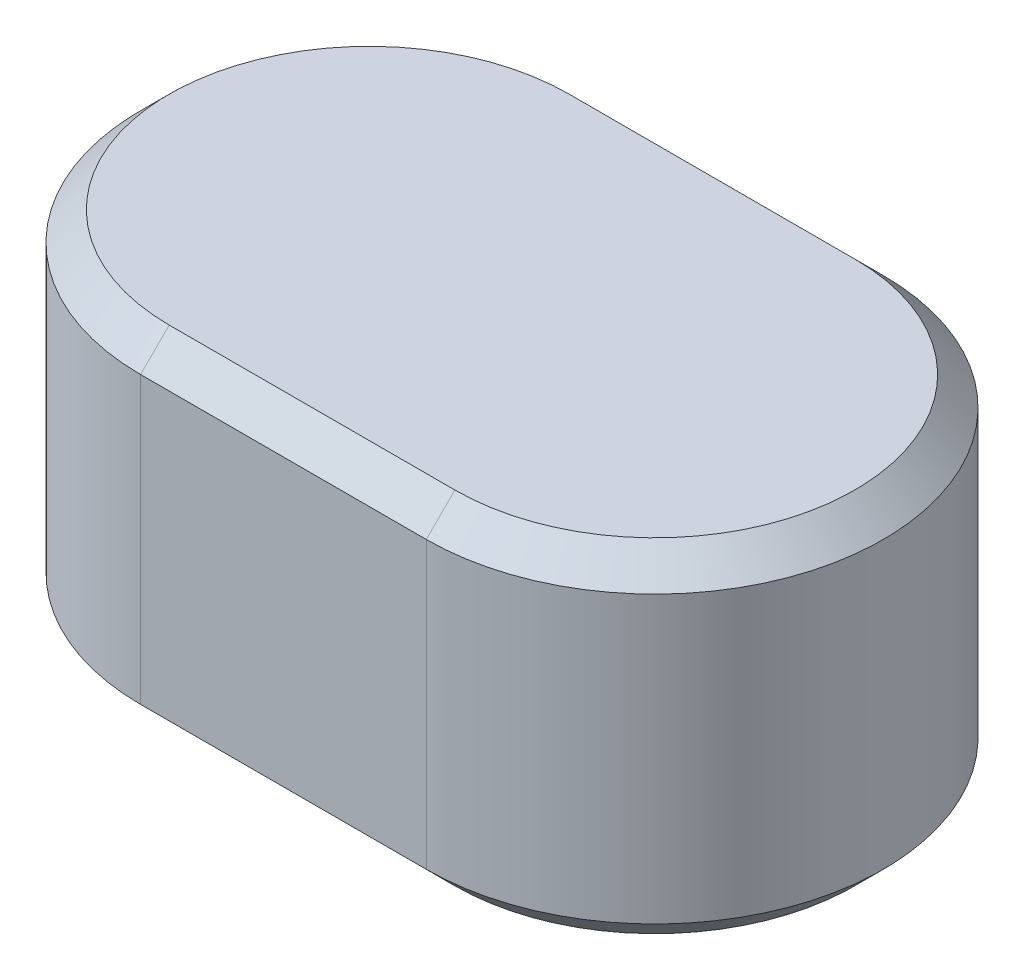
ISO-10303-21;
HEADER;
FILE_DESCRIPTION(('STEP AP214'),'2;1');
FILE_NAME('part.step','',(''),(''),'','','');
FILE_SCHEMA(('AUTOMOTIVE_DESIGN { 1 0 10303 214 1 1 1 1 }'));
ENDSEC;
DATA;
#1=APPLICATION_CONTEXT('core data for automotive mechanical design processes');
#2=APPLICATION_PROTOCOL_DEFINITION('international standard','automotive_design',2000,#1);
#3=PRODUCT_CONTEXT('',#1,'mechanical');
#4=PRODUCT('Part','Part','',(#3));
#5=PRODUCT_RELATED_PRODUCT_CATEGORY('part','',(#4));
#6=PRODUCT_DEFINITION_FORMATION('','',#4);
#7=PRODUCT_DEFINITION_CONTEXT('part definition',#1,'design');
#8=PRODUCT_DEFINITION('design','',#6,#7);
#9=PRODUCT_DEFINITION_SHAPE('','',#8);
#10=(LENGTH_UNIT() NAMED_UNIT(*) SI_UNIT(.MILLI.,.METRE.));
#11=(NAMED_UNIT(*) PLANE_ANGLE_UNIT() SI_UNIT($,.RADIAN.));
#12=(NAMED_UNIT(*) SI_UNIT($,.STERADIAN.) SOLID_ANGLE_UNIT());
#13=UNCERTAINTY_MEASURE_WITH_UNIT(LENGTH_MEASURE(1.E-05),#10,'distance_accuracy_value','');
#14=(GEOMETRIC_REPRESENTATION_CONTEXT(3) GLOBAL_UNCERTAINTY_ASSIGNED_CONTEXT((#13)) GLOBAL_UNIT_ASSIGNED_CONTEXT((#10,
#11,#12)) REPRESENTATION_CONTEXT('',''));
#15=CARTESIAN_POINT('',(0.,0.,0.));
#16=DIRECTION('',(0.,0.,1.));
#17=DIRECTION('',(1.,0.,0.));
#18=AXIS2_PLACEMENT_3D('',#15,#16,#17);
#19=CARTESIAN_POINT('',(-2.5,6.,0.));
#20=DIRECTION('',(0.,-1.,0.));
#21=DIRECTION('',(0.,0.,-1.));
#22=AXIS2_PLACEMENT_3D('',#19,#20,#21);
#23=CYLINDRICAL_SURFACE('',#22,4.);
#24=DIRECTION('',(0.,-1.,0.));
#25=VECTOR('',#24,1.);
#26=CARTESIAN_POINT('',(-2.5,6.,-4.));
#27=LINE('',#26,#25);
#28=CARTESIAN_POINT('',(-2.5,5.5,-4.));
#29=VERTEX_POINT('',#28);
#30=CARTESIAN_POINT('',(-2.5,0.500000000000002,-4.));
#31=VERTEX_POINT('',#30);
#32=EDGE_CURVE('E161',#29,#31,#27,.T.);
#33=ORIENTED_EDGE('',*,*,#32,.T.);
#34=CARTESIAN_POINT('',(-2.5,0.500000000000002,0.));
#35=DIRECTION('',(0.,1.,0.));
#36=DIRECTION('',(0.,0.,1.));
#37=AXIS2_PLACEMENT_3D('',#34,#35,#36);
#38=CIRCLE('',#37,4.);
#39=CARTESIAN_POINT('',(-2.5,0.500000000000002,4.));
#40=VERTEX_POINT('',#39);
#41=EDGE_CURVE('E175',#31,#40,#38,.T.);
#42=ORIENTED_EDGE('',*,*,#41,.T.);
#43=DIRECTION('',(0.,-1.,0.));
#44=VECTOR('',#43,1.);
#45=CARTESIAN_POINT('',(-2.5,6.,4.));
#46=LINE('',#45,#44);
#47=CARTESIAN_POINT('',(-2.5,5.5,4.));
#48=VERTEX_POINT('',#47);
#49=EDGE_CURVE('E132',#48,#40,#46,.T.);
#50=ORIENTED_EDGE('',*,*,#49,.F.);
#51=CARTESIAN_POINT('',(-2.5,5.5,0.));
#52=DIRECTION('',(0.,1.,0.));
#53=DIRECTION('',(0.,0.,1.));
#54=AXIS2_PLACEMENT_3D('',#51,#52,#53);
#55=CIRCLE('',#54,4.);
#56=EDGE_CURVE('E178',#48,#29,#55,.F.);
#57=ORIENTED_EDGE('',*,*,#56,.T.);
#58=EDGE_LOOP('',(#33,#42,#50,#57));
#59=FACE_BOUND('',#58,.T.);
#60=ADVANCED_FACE('F41',(#59),#23,.T.);
#61=CARTESIAN_POINT('',(-2.5,6.,4.));
#62=DIRECTION('',(0.,0.,-1.));
#63=DIRECTION('',(-1.,0.,0.));
#64=AXIS2_PLACEMENT_3D('',#61,#62,#63);
#65=PLANE('',#64);
#66=ORIENTED_EDGE('',*,*,#49,.T.);
#67=DIRECTION('',(1.,0.,0.));
#68=VECTOR('',#67,1.);
#69=CARTESIAN_POINT('',(-2.5,0.500000000000002,4.));
#70=LINE('',#69,#68);
#71=CARTESIAN_POINT('',(2.5,0.500000000000002,4.));
#72=VERTEX_POINT('',#71);
#73=EDGE_CURVE('E130',#40,#72,#70,.T.);
#74=ORIENTED_EDGE('',*,*,#73,.T.);
#75=DIRECTION('',(0.,-1.,0.));
#76=VECTOR('',#75,1.);
#77=CARTESIAN_POINT('',(2.5,6.,4.));
#78=LINE('',#77,#76);
#79=CARTESIAN_POINT('',(2.5,5.5,4.));
#80=VERTEX_POINT('',#79);
#81=EDGE_CURVE('E112',#80,#72,#78,.T.);
#82=ORIENTED_EDGE('',*,*,#81,.F.);
#83=DIRECTION('',(-1.,0.,0.));
#84=VECTOR('',#83,1.);
#85=CARTESIAN_POINT('',(-2.5,5.5,4.));
#86=LINE('',#85,#84);
#87=EDGE_CURVE('E127',#80,#48,#86,.T.);
#88=ORIENTED_EDGE('',*,*,#87,.T.);
#89=EDGE_LOOP('',(#66,#74,#82,#88));
#90=FACE_BOUND('',#89,.T.);
#91=ADVANCED_FACE('F126',(#90),#65,.F.);
#92=CARTESIAN_POINT('',(2.5,6.,0.));
#93=DIRECTION('',(0.,-1.,0.));
#94=DIRECTION('',(0.,0.,-1.));
#95=AXIS2_PLACEMENT_3D('',#92,#93,#94);
#96=CYLINDRICAL_SURFACE('',#95,4.);
#97=ORIENTED_EDGE('',*,*,#81,.T.);
#98=CARTESIAN_POINT('',(2.5,0.500000000000002,0.));
#99=DIRECTION('',(0.,1.,0.));
#100=DIRECTION('',(0.,0.,1.));
#101=AXIS2_PLACEMENT_3D('',#98,#99,#100);
#102=CIRCLE('',#101,4.);
#103=CARTESIAN_POINT('',(2.5,0.500000000000002,-4.));
#104=VERTEX_POINT('',#103);
#105=EDGE_CURVE('E119',#72,#104,#102,.T.);
#106=ORIENTED_EDGE('',*,*,#105,.T.);
#107=DIRECTION('',(0.,-1.,0.));
#108=VECTOR('',#107,1.);
#109=CARTESIAN_POINT('',(2.5,6.,-4.));
#110=LINE('',#109,#108);
#111=CARTESIAN_POINT('',(2.5,5.5,-4.));
#112=VERTEX_POINT('',#111);
#113=EDGE_CURVE('E114',#112,#104,#110,.T.);
#114=ORIENTED_EDGE('',*,*,#113,.F.);
#115=CARTESIAN_POINT('',(2.5,5.5,0.));
#116=DIRECTION('',(0.,1.,0.));
#117=DIRECTION('',(0.,0.,1.));
#118=AXIS2_PLACEMENT_3D('',#115,#116,#117);
#119=CIRCLE('',#118,4.);
#120=EDGE_CURVE('E109',#112,#80,#119,.F.);
#121=ORIENTED_EDGE('',*,*,#120,.T.);
#122=EDGE_LOOP('',(#97,#106,#114,#121));
#123=FACE_BOUND('',#122,.T.);
#124=ADVANCED_FACE('F111',(#123),#96,.T.);
#125=CARTESIAN_POINT('',(-2.5,6.,-4.));
#126=DIRECTION('',(0.,0.,1.));
#127=DIRECTION('',(1.,0.,0.));
#128=AXIS2_PLACEMENT_3D('',#125,#126,#127);
#129=PLANE('',#128);
#130=ORIENTED_EDGE('',*,*,#113,.T.);
#131=DIRECTION('',(-1.,0.,0.));
#132=VECTOR('',#131,1.);
#133=CARTESIAN_POINT('',(-2.5,0.500000000000002,-4.));
#134=LINE('',#133,#132);
#135=EDGE_CURVE('E181',#104,#31,#134,.T.);
#136=ORIENTED_EDGE('',*,*,#135,.T.);
#137=ORIENTED_EDGE('',*,*,#32,.F.);
#138=DIRECTION('',(1.,0.,0.));
#139=VECTOR('',#138,1.);
#140=CARTESIAN_POINT('',(2.5,5.5,-4.));
#141=LINE('',#140,#139);
#142=EDGE_CURVE('E184',#29,#112,#141,.T.);
#143=ORIENTED_EDGE('',*,*,#142,.T.);
#144=EDGE_LOOP('',(#130,#136,#137,#143));
#145=FACE_BOUND('',#144,.T.);
#146=ADVANCED_FACE('F232',(#145),#129,.F.);
#147=CARTESIAN_POINT('',(-2.5,6.,0.));
#148=DIRECTION('',(0.,1.,0.));
#149=DIRECTION('',(0.,0.,1.));
#150=AXIS2_PLACEMENT_3D('',#147,#148,#149);
#151=PLANE('',#150);
#152=CARTESIAN_POINT('',(2.5,6.,0.));
#153=DIRECTION('',(0.,1.,0.));
#154=DIRECTION('',(0.,0.,1.));
#155=AXIS2_PLACEMENT_3D('',#152,#153,#154);
#156=CIRCLE('',#155,3.5);
#157=CARTESIAN_POINT('',(2.5,6.,3.5));
#158=VERTEX_POINT('',#157);
#159=CARTESIAN_POINT('',(2.5,6.,-3.5));
#160=VERTEX_POINT('',#159);
#161=EDGE_CURVE('E52',#158,#160,#156,.T.);
#162=ORIENTED_EDGE('',*,*,#161,.T.);
#163=DIRECTION('',(-1.,0.,0.));
#164=VECTOR('',#163,1.);
#165=CARTESIAN_POINT('',(-2.5,6.,-3.5));
#166=LINE('',#165,#164);
#167=CARTESIAN_POINT('',(-2.5,6.,-3.5));
#168=VERTEX_POINT('',#167);
#169=EDGE_CURVE('E11',#160,#168,#166,.T.);
#170=ORIENTED_EDGE('',*,*,#169,.T.);
#171=CARTESIAN_POINT('',(-2.5,6.,0.));
#172=DIRECTION('',(0.,1.,0.));
#173=DIRECTION('',(0.,0.,1.));
#174=AXIS2_PLACEMENT_3D('',#171,#172,#173);
#175=CIRCLE('',#174,3.5);
#176=CARTESIAN_POINT('',(-2.5,6.,3.5));
#177=VERTEX_POINT('',#176);
#178=EDGE_CURVE('E172',#168,#177,#175,.T.);
#179=ORIENTED_EDGE('',*,*,#178,.T.);
#180=DIRECTION('',(1.,0.,0.));
#181=VECTOR('',#180,1.);
#182=CARTESIAN_POINT('',(2.5,6.,3.5));
#183=LINE('',#182,#181);
#184=EDGE_CURVE('E63',#177,#158,#183,.T.);
#185=ORIENTED_EDGE('',*,*,#184,.T.);
#186=EDGE_LOOP('',(#162,#170,#179,#185));
#187=FACE_BOUND('',#186,.T.);
#188=ADVANCED_FACE('F238',(#187),#151,.T.);
#189=CARTESIAN_POINT('',(-2.5,0.,0.));
#190=DIRECTION('',(0.,1.,0.));
#191=DIRECTION('',(0.,0.,1.));
#192=AXIS2_PLACEMENT_3D('',#189,#190,#191);
#193=PLANE('',#192);
#194=CARTESIAN_POINT('',(2.5,0.,0.));
#195=DIRECTION('',(0.,1.,0.));
#196=DIRECTION('',(0.,0.,1.));
#197=AXIS2_PLACEMENT_3D('',#194,#195,#196);
#198=CIRCLE('',#197,3.49999999999999);
#199=CARTESIAN_POINT('',(2.5,0.,-3.5));
#200=VERTEX_POINT('',#199);
#201=CARTESIAN_POINT('',(2.5,0.,3.49999999999999));
#202=VERTEX_POINT('',#201);
#203=EDGE_CURVE('E192',#200,#202,#198,.F.);
#204=ORIENTED_EDGE('',*,*,#203,.T.);
#205=DIRECTION('',(-1.,0.,0.));
#206=VECTOR('',#205,1.);
#207=CARTESIAN_POINT('',(-2.5,0.,3.49999999999999));
#208=LINE('',#207,#206);
#209=CARTESIAN_POINT('',(-2.5,0.,3.49999999999999));
#210=VERTEX_POINT('',#209);
#211=EDGE_CURVE('E120',#202,#210,#208,.T.);
#212=ORIENTED_EDGE('',*,*,#211,.T.);
#213=CARTESIAN_POINT('',(-2.5,0.,0.));
#214=DIRECTION('',(0.,1.,0.));
#215=DIRECTION('',(0.,0.,1.));
#216=AXIS2_PLACEMENT_3D('',#213,#214,#215);
#217=CIRCLE('',#216,3.49999999999999);
#218=CARTESIAN_POINT('',(-2.5,0.,-3.49999999999999));
#219=VERTEX_POINT('',#218);
#220=EDGE_CURVE('E198',#210,#219,#217,.F.);
#221=ORIENTED_EDGE('',*,*,#220,.T.);
#222=DIRECTION('',(1.,0.,0.));
#223=VECTOR('',#222,1.);
#224=CARTESIAN_POINT('',(-2.5,0.,-3.49999999999999));
#225=LINE('',#224,#223);
#226=EDGE_CURVE('E195',#219,#200,#225,.T.);
#227=ORIENTED_EDGE('',*,*,#226,.T.);
#228=EDGE_LOOP('',(#204,#212,#221,#227));
#229=FACE_BOUND('',#228,.T.);
#230=ADVANCED_FACE('F240',(#229),#193,.F.);
#231=CARTESIAN_POINT('',(-2.5,0.500000000000002,-4.));
#232=DIRECTION('',(0.,0.70710678118655,0.707106781186545));
#233=DIRECTION('',(-1.,0.,0.));
#234=AXIS2_PLACEMENT_3D('',#231,#232,#233);
#235=PLANE('',#234);
#236=DIRECTION('',(0.,0.707106781186545,-0.70710678118655));
#237=VECTOR('',#236,1.);
#238=CARTESIAN_POINT('',(2.5,0.,-3.5));
#239=LINE('',#238,#237);
#240=EDGE_CURVE('E162',#200,#104,#239,.T.);
#241=ORIENTED_EDGE('',*,*,#240,.F.);
#242=ORIENTED_EDGE('',*,*,#226,.F.);
#243=DIRECTION('',(0.,-0.707106781186545,0.70710678118655));
#244=VECTOR('',#243,1.);
#245=CARTESIAN_POINT('',(-2.5,0.500000000000002,-4.));
#246=LINE('',#245,#244);
#247=EDGE_CURVE('E157',#31,#219,#246,.T.);
#248=ORIENTED_EDGE('',*,*,#247,.F.);
#249=ORIENTED_EDGE('',*,*,#135,.F.);
#250=EDGE_LOOP('',(#241,#242,#248,#249));
#251=FACE_BOUND('',#250,.T.);
#252=ADVANCED_FACE('F219',(#251),#235,.F.);
#253=CARTESIAN_POINT('',(-2.5,0.500000000000002,0.));
#254=DIRECTION('',(0.,1.,0.));
#255=DIRECTION('',(0.,0.,1.));
#256=AXIS2_PLACEMENT_3D('',#253,#254,#255);
#257=CONICAL_SURFACE('',#256,4.,0.785398163397452);
#258=ORIENTED_EDGE('',*,*,#247,.T.);
#259=ORIENTED_EDGE('',*,*,#220,.F.);
#260=DIRECTION('',(0.,-0.707106781186545,-0.70710678118655));
#261=VECTOR('',#260,1.);
#262=CARTESIAN_POINT('',(-2.5,0.500000000000002,4.));
#263=LINE('',#262,#261);
#264=EDGE_CURVE('E146',#40,#210,#263,.T.);
#265=ORIENTED_EDGE('',*,*,#264,.F.);
#266=ORIENTED_EDGE('',*,*,#41,.F.);
#267=EDGE_LOOP('',(#258,#259,#265,#266));
#268=FACE_BOUND('',#267,.T.);
#269=ADVANCED_FACE('F223',(#268),#257,.T.);
#270=CARTESIAN_POINT('',(2.5,0.500000000000002,0.));
#271=DIRECTION('',(0.,1.,0.));
#272=DIRECTION('',(0.,0.,1.));
#273=AXIS2_PLACEMENT_3D('',#270,#271,#272);
#274=CONICAL_SURFACE('',#273,4.,0.785398163397452);
#275=ORIENTED_EDGE('',*,*,#240,.T.);
#276=ORIENTED_EDGE('',*,*,#105,.F.);
#277=DIRECTION('',(0.,0.707106781186545,0.70710678118655));
#278=VECTOR('',#277,1.);
#279=CARTESIAN_POINT('',(2.5,0.,3.49999999999999));
#280=LINE('',#279,#278);
#281=EDGE_CURVE('E143',#202,#72,#280,.T.);
#282=ORIENTED_EDGE('',*,*,#281,.F.);
#283=ORIENTED_EDGE('',*,*,#203,.F.);
#284=EDGE_LOOP('',(#275,#276,#282,#283));
#285=FACE_BOUND('',#284,.T.);
#286=ADVANCED_FACE('F231',(#285),#274,.T.);
#287=CARTESIAN_POINT('',(-2.5,0.500000000000002,4.));
#288=DIRECTION('',(0.,0.70710678118655,-0.707106781186545));
#289=DIRECTION('',(1.,0.,0.));
#290=AXIS2_PLACEMENT_3D('',#287,#288,#289);
#291=PLANE('',#290);
#292=ORIENTED_EDGE('',*,*,#264,.T.);
#293=ORIENTED_EDGE('',*,*,#211,.F.);
#294=ORIENTED_EDGE('',*,*,#281,.T.);
#295=ORIENTED_EDGE('',*,*,#73,.F.);
#296=EDGE_LOOP('',(#292,#293,#294,#295));
#297=FACE_BOUND('',#296,.T.);
#298=ADVANCED_FACE('F226',(#297),#291,.F.);
#299=CARTESIAN_POINT('',(-2.5,6.,3.5));
#300=DIRECTION('',(0.,0.707106781186546,0.707106781186549));
#301=DIRECTION('',(-1.,0.,0.));
#302=AXIS2_PLACEMENT_3D('',#299,#300,#301);
#303=PLANE('',#302);
#304=DIRECTION('',(0.,0.707106781186549,-0.707106781186546));
#305=VECTOR('',#304,1.);
#306=CARTESIAN_POINT('',(-2.5,5.5,4.));
#307=LINE('',#306,#305);
#308=EDGE_CURVE('E137',#48,#177,#307,.T.);
#309=ORIENTED_EDGE('',*,*,#308,.F.);
#310=ORIENTED_EDGE('',*,*,#87,.F.);
#311=DIRECTION('',(0.,-0.707106781186549,0.707106781186546));
#312=VECTOR('',#311,1.);
#313=CARTESIAN_POINT('',(2.5,6.,3.5));
#314=LINE('',#313,#312);
#315=EDGE_CURVE('E46',#158,#80,#314,.T.);
#316=ORIENTED_EDGE('',*,*,#315,.F.);
#317=ORIENTED_EDGE('',*,*,#184,.F.);
#318=EDGE_LOOP('',(#309,#310,#316,#317));
#319=FACE_BOUND('',#318,.T.);
#320=ADVANCED_FACE('F44',(#319),#303,.T.);
#321=CARTESIAN_POINT('',(2.5,6.,0.));
#322=DIRECTION('',(0.,-1.,0.));
#323=DIRECTION('',(0.,0.,-1.));
#324=AXIS2_PLACEMENT_3D('',#321,#322,#323);
#325=CONICAL_SURFACE('',#324,3.5,0.785398163397447);
#326=ORIENTED_EDGE('',*,*,#315,.T.);
#327=ORIENTED_EDGE('',*,*,#120,.F.);
#328=DIRECTION('',(0.,-0.707106781186549,-0.707106781186546));
#329=VECTOR('',#328,1.);
#330=CARTESIAN_POINT('',(2.5,6.,-3.5));
#331=LINE('',#330,#329);
#332=EDGE_CURVE('E148',#160,#112,#331,.T.);
#333=ORIENTED_EDGE('',*,*,#332,.F.);
#334=ORIENTED_EDGE('',*,*,#161,.F.);
#335=EDGE_LOOP('',(#326,#327,#333,#334));
#336=FACE_BOUND('',#335,.T.);
#337=ADVANCED_FACE('F141',(#336),#325,.T.);
#338=CARTESIAN_POINT('',(-2.5,6.,0.));
#339=DIRECTION('',(0.,-1.,0.));
#340=DIRECTION('',(0.,0.,-1.));
#341=AXIS2_PLACEMENT_3D('',#338,#339,#340);
#342=CONICAL_SURFACE('',#341,3.5,0.785398163397447);
#343=ORIENTED_EDGE('',*,*,#308,.T.);
#344=ORIENTED_EDGE('',*,*,#178,.F.);
#345=DIRECTION('',(0.,0.707106781186549,0.707106781186546));
#346=VECTOR('',#345,1.);
#347=CARTESIAN_POINT('',(-2.5,5.5,-4.));
#348=LINE('',#347,#346);
#349=EDGE_CURVE('E152',#29,#168,#348,.T.);
#350=ORIENTED_EDGE('',*,*,#349,.F.);
#351=ORIENTED_EDGE('',*,*,#56,.F.);
#352=EDGE_LOOP('',(#343,#344,#350,#351));
#353=FACE_BOUND('',#352,.T.);
#354=ADVANCED_FACE('F237',(#353),#342,.T.);
#355=CARTESIAN_POINT('',(-2.5,6.,-3.5));
#356=DIRECTION('',(0.,0.707106781186546,-0.707106781186549));
#357=DIRECTION('',(1.,0.,0.));
#358=AXIS2_PLACEMENT_3D('',#355,#356,#357);
#359=PLANE('',#358);
#360=ORIENTED_EDGE('',*,*,#332,.T.);
#361=ORIENTED_EDGE('',*,*,#142,.F.);
#362=ORIENTED_EDGE('',*,*,#349,.T.);
#363=ORIENTED_EDGE('',*,*,#169,.F.);
#364=EDGE_LOOP('',(#360,#361,#362,#363));
#365=FACE_BOUND('',#364,.T.);
#366=ADVANCED_FACE('F235',(#365),#359,.T.);
#367=CLOSED_SHELL('',(#60,#91,#124,#146,#188,#230,#252,#269,#286,#298,#320,#337,#354,#366));
#368=MANIFOLD_SOLID_BREP('B2',#367);
#369=ADVANCED_BREP_SHAPE_REPRESENTATION('',(#18,#368),#14);
#370=SHAPE_DEFINITION_REPRESENTATION(#9,#369);
ENDSEC;
END-ISO-10303-21;
